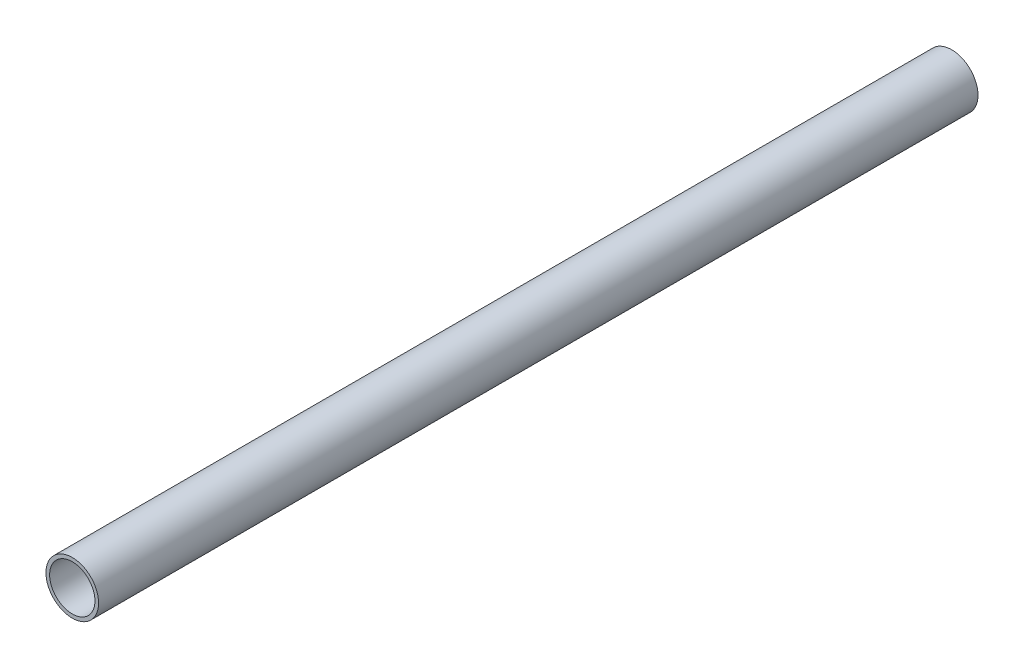
ISO-10303-21;
HEADER;
FILE_DESCRIPTION(('STEP AP214'),'2;1');
FILE_NAME('part.step','',(''),(''),'','','');
FILE_SCHEMA(('AUTOMOTIVE_DESIGN { 1 0 10303 214 1 1 1 1 }'));
ENDSEC;
DATA;
#1=APPLICATION_CONTEXT('core data for automotive mechanical design processes');
#2=APPLICATION_PROTOCOL_DEFINITION('international standard','automotive_design',2000,#1);
#3=PRODUCT_CONTEXT('',#1,'mechanical');
#4=PRODUCT('Part','Part','',(#3));
#5=PRODUCT_RELATED_PRODUCT_CATEGORY('part','',(#4));
#6=PRODUCT_DEFINITION_FORMATION('','',#4);
#7=PRODUCT_DEFINITION_CONTEXT('part definition',#1,'design');
#8=PRODUCT_DEFINITION('design','',#6,#7);
#9=PRODUCT_DEFINITION_SHAPE('','',#8);
#10=(LENGTH_UNIT() NAMED_UNIT(*) SI_UNIT(.MILLI.,.METRE.));
#11=(NAMED_UNIT(*) PLANE_ANGLE_UNIT() SI_UNIT($,.RADIAN.));
#12=(NAMED_UNIT(*) SI_UNIT($,.STERADIAN.) SOLID_ANGLE_UNIT());
#13=UNCERTAINTY_MEASURE_WITH_UNIT(LENGTH_MEASURE(1.E-05),#10,'distance_accuracy_value','');
#14=(GEOMETRIC_REPRESENTATION_CONTEXT(3) GLOBAL_UNCERTAINTY_ASSIGNED_CONTEXT((#13)) GLOBAL_UNIT_ASSIGNED_CONTEXT((#10,
#11,#12)) REPRESENTATION_CONTEXT('',''));
#15=CARTESIAN_POINT('',(0.,0.,0.));
#16=DIRECTION('',(0.,0.,1.));
#17=DIRECTION('',(1.,0.,0.));
#18=AXIS2_PLACEMENT_3D('',#15,#16,#17);
#19=CARTESIAN_POINT('',(0.,0.,252.3));
#20=DIRECTION('',(0.,0.,1.));
#21=DIRECTION('',(1.,0.,0.));
#22=AXIS2_PLACEMENT_3D('',#19,#20,#21);
#23=PLANE('',#22);
#24=CARTESIAN_POINT('',(0.,0.,252.3));
#25=DIRECTION('',(0.,0.,1.));
#26=DIRECTION('',(1.,0.,0.));
#27=AXIS2_PLACEMENT_3D('',#24,#25,#26);
#28=CIRCLE('',#27,7.55);
#29=CARTESIAN_POINT('',(7.55,0.,252.3));
#30=VERTEX_POINT('',#29);
#31=EDGE_CURVE('E10',#30,#30,#28,.T.);
#32=ORIENTED_EDGE('',*,*,#31,.T.);
#33=EDGE_LOOP('',(#32));
#34=FACE_BOUND('',#33,.T.);
#35=CARTESIAN_POINT('',(0.,0.,252.3));
#36=DIRECTION('',(0.,0.,1.));
#37=DIRECTION('',(1.,0.,0.));
#38=AXIS2_PLACEMENT_3D('',#35,#36,#37);
#39=CIRCLE('',#38,6.5);
#40=CARTESIAN_POINT('',(6.5,0.,252.3));
#41=VERTEX_POINT('',#40);
#42=EDGE_CURVE('E43',#41,#41,#39,.T.);
#43=ORIENTED_EDGE('',*,*,#42,.F.);
#44=EDGE_LOOP('',(#43));
#45=FACE_BOUND('',#44,.T.);
#46=ADVANCED_FACE('F32',(#34,#45),#23,.T.);
#47=CARTESIAN_POINT('',(0.,0.,0.));
#48=DIRECTION('',(0.,0.,1.));
#49=DIRECTION('',(1.,0.,0.));
#50=AXIS2_PLACEMENT_3D('',#47,#48,#49);
#51=PLANE('',#50);
#52=CARTESIAN_POINT('',(0.,0.,0.));
#53=DIRECTION('',(0.,0.,1.));
#54=DIRECTION('',(1.,0.,0.));
#55=AXIS2_PLACEMENT_3D('',#52,#53,#54);
#56=CIRCLE('',#55,7.55);
#57=CARTESIAN_POINT('',(7.55,0.,0.));
#58=VERTEX_POINT('',#57);
#59=EDGE_CURVE('E36',#58,#58,#56,.T.);
#60=ORIENTED_EDGE('',*,*,#59,.F.);
#61=EDGE_LOOP('',(#60));
#62=FACE_BOUND('',#61,.T.);
#63=CARTESIAN_POINT('',(0.,0.,0.));
#64=DIRECTION('',(0.,0.,1.));
#65=DIRECTION('',(1.,0.,0.));
#66=AXIS2_PLACEMENT_3D('',#63,#64,#65);
#67=CIRCLE('',#66,6.5);
#68=CARTESIAN_POINT('',(6.5,0.,0.));
#69=VERTEX_POINT('',#68);
#70=EDGE_CURVE('E45',#69,#69,#67,.T.);
#71=ORIENTED_EDGE('',*,*,#70,.T.);
#72=EDGE_LOOP('',(#71));
#73=FACE_BOUND('',#72,.T.);
#74=ADVANCED_FACE('F55',(#62,#73),#51,.F.);
#75=CARTESIAN_POINT('',(0.,0.,252.3));
#76=DIRECTION('',(0.,0.,-1.));
#77=DIRECTION('',(-1.,0.,0.));
#78=AXIS2_PLACEMENT_3D('',#75,#76,#77);
#79=CYLINDRICAL_SURFACE('',#78,7.55);
#80=ORIENTED_EDGE('',*,*,#31,.F.);
#81=EDGE_LOOP('',(#80));
#82=FACE_BOUND('',#81,.T.);
#83=ORIENTED_EDGE('',*,*,#59,.T.);
#84=EDGE_LOOP('',(#83));
#85=FACE_BOUND('',#84,.T.);
#86=ADVANCED_FACE('F34',(#82,#85),#79,.T.);
#87=CARTESIAN_POINT('',(0.,0.,252.3));
#88=DIRECTION('',(0.,0.,-1.));
#89=DIRECTION('',(-1.,0.,0.));
#90=AXIS2_PLACEMENT_3D('',#87,#88,#89);
#91=CYLINDRICAL_SURFACE('',#90,6.5);
#92=ORIENTED_EDGE('',*,*,#42,.T.);
#93=EDGE_LOOP('',(#92));
#94=FACE_BOUND('',#93,.T.);
#95=ORIENTED_EDGE('',*,*,#70,.F.);
#96=EDGE_LOOP('',(#95));
#97=FACE_BOUND('',#96,.T.);
#98=ADVANCED_FACE('F51',(#94,#97),#91,.F.);
#99=CLOSED_SHELL('',(#46,#74,#86,#98));
#100=MANIFOLD_SOLID_BREP('B2',#99);
#101=ADVANCED_BREP_SHAPE_REPRESENTATION('',(#18,#100),#14);
#102=SHAPE_DEFINITION_REPRESENTATION(#9,#101);
ENDSEC;
END-ISO-10303-21;
